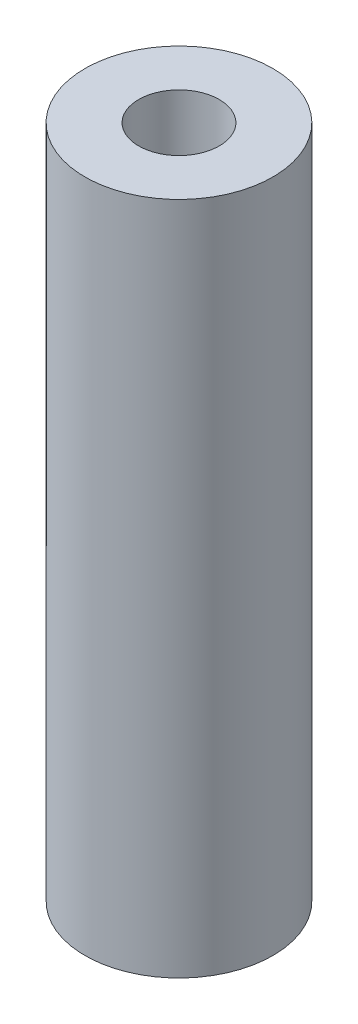
ISO-10303-21;
HEADER;
FILE_DESCRIPTION(('STEP AP214'),'2;1');
FILE_NAME('part.step','',(''),(''),'','','');
FILE_SCHEMA(('AUTOMOTIVE_DESIGN { 1 0 10303 214 1 1 1 1 }'));
ENDSEC;
DATA;
#1=APPLICATION_CONTEXT('core data for automotive mechanical design processes');
#2=APPLICATION_PROTOCOL_DEFINITION('international standard','automotive_design',2000,#1);
#3=PRODUCT_CONTEXT('',#1,'mechanical');
#4=PRODUCT('Part','Part','',(#3));
#5=PRODUCT_RELATED_PRODUCT_CATEGORY('part','',(#4));
#6=PRODUCT_DEFINITION_FORMATION('','',#4);
#7=PRODUCT_DEFINITION_CONTEXT('part definition',#1,'design');
#8=PRODUCT_DEFINITION('design','',#6,#7);
#9=PRODUCT_DEFINITION_SHAPE('','',#8);
#10=(LENGTH_UNIT() NAMED_UNIT(*) SI_UNIT(.MILLI.,.METRE.));
#11=(NAMED_UNIT(*) PLANE_ANGLE_UNIT() SI_UNIT($,.RADIAN.));
#12=(NAMED_UNIT(*) SI_UNIT($,.STERADIAN.) SOLID_ANGLE_UNIT());
#13=UNCERTAINTY_MEASURE_WITH_UNIT(LENGTH_MEASURE(1.E-05),#10,'distance_accuracy_value','');
#14=(GEOMETRIC_REPRESENTATION_CONTEXT(3) GLOBAL_UNCERTAINTY_ASSIGNED_CONTEXT((#13)) GLOBAL_UNIT_ASSIGNED_CONTEXT((#10,
#11,#12)) REPRESENTATION_CONTEXT('',''));
#15=CARTESIAN_POINT('',(0.,0.,0.));
#16=DIRECTION('',(0.,0.,1.));
#17=DIRECTION('',(1.,0.,0.));
#18=AXIS2_PLACEMENT_3D('',#15,#16,#17);
#19=CARTESIAN_POINT('',(0.,28.699968,0.));
#20=DIRECTION('',(0.,1.,0.));
#21=DIRECTION('',(0.,0.,1.));
#22=AXIS2_PLACEMENT_3D('',#19,#20,#21);
#23=PLANE('',#22);
#24=CARTESIAN_POINT('',(0.,28.699968,0.));
#25=DIRECTION('',(0.,1.,0.));
#26=DIRECTION('',(0.,0.,1.));
#27=AXIS2_PLACEMENT_3D('',#24,#25,#26);
#28=CIRCLE('',#27,4.);
#29=CARTESIAN_POINT('',(0.,28.699968,-4.));
#30=VERTEX_POINT('',#29);
#31=EDGE_CURVE('E10',#30,#30,#28,.T.);
#32=ORIENTED_EDGE('',*,*,#31,.T.);
#33=EDGE_LOOP('',(#32));
#34=FACE_BOUND('',#33,.T.);
#35=CARTESIAN_POINT('',(0.,28.699968,0.));
#36=DIRECTION('',(0.,1.,0.));
#37=DIRECTION('',(0.,0.,1.));
#38=AXIS2_PLACEMENT_3D('',#35,#36,#37);
#39=CIRCLE('',#38,1.7145);
#40=CARTESIAN_POINT('',(0.,28.699968,-1.7145));
#41=VERTEX_POINT('',#40);
#42=EDGE_CURVE('E52',#41,#41,#39,.T.);
#43=ORIENTED_EDGE('',*,*,#42,.F.);
#44=EDGE_LOOP('',(#43));
#45=FACE_BOUND('',#44,.T.);
#46=ADVANCED_FACE('F41',(#34,#45),#23,.T.);
#47=CARTESIAN_POINT('',(0.,0.,0.));
#48=DIRECTION('',(0.,1.,0.));
#49=DIRECTION('',(0.,0.,1.));
#50=AXIS2_PLACEMENT_3D('',#47,#48,#49);
#51=PLANE('',#50);
#52=CARTESIAN_POINT('',(0.,0.,0.));
#53=DIRECTION('',(0.,1.,0.));
#54=DIRECTION('',(0.,0.,1.));
#55=AXIS2_PLACEMENT_3D('',#52,#53,#54);
#56=CIRCLE('',#55,4.);
#57=CARTESIAN_POINT('',(0.,0.,-4.));
#58=VERTEX_POINT('',#57);
#59=EDGE_CURVE('E45',#58,#58,#56,.T.);
#60=ORIENTED_EDGE('',*,*,#59,.F.);
#61=EDGE_LOOP('',(#60));
#62=FACE_BOUND('',#61,.T.);
#63=CARTESIAN_POINT('',(0.,0.,0.));
#64=DIRECTION('',(0.,1.,0.));
#65=DIRECTION('',(0.,0.,1.));
#66=AXIS2_PLACEMENT_3D('',#63,#64,#65);
#67=CIRCLE('',#66,1.7145);
#68=CARTESIAN_POINT('',(0.,0.,-1.7145));
#69=VERTEX_POINT('',#68);
#70=EDGE_CURVE('E54',#69,#69,#67,.T.);
#71=ORIENTED_EDGE('',*,*,#70,.T.);
#72=EDGE_LOOP('',(#71));
#73=FACE_BOUND('',#72,.T.);
#74=ADVANCED_FACE('F64',(#62,#73),#51,.F.);
#75=CARTESIAN_POINT('',(0.,28.699968,0.));
#76=DIRECTION('',(0.,-1.,0.));
#77=DIRECTION('',(0.,0.,-1.));
#78=AXIS2_PLACEMENT_3D('',#75,#76,#77);
#79=CYLINDRICAL_SURFACE('',#78,4.);
#80=CARTESIAN_POINT('',(0.,28.699968,-4.));
#81=CARTESIAN_POINT('',(0.,28.40101,-4.));
#82=CARTESIAN_POINT('',(0.,28.102052,-4.));
#83=CARTESIAN_POINT('',(0.,27.504136,-4.));
#84=CARTESIAN_POINT('',(0.,27.205178,-4.));
#85=CARTESIAN_POINT('',(0.,26.607262,-4.));
#86=CARTESIAN_POINT('',(0.,26.308304,-4.));
#87=CARTESIAN_POINT('',(0.,25.710388,-4.));
#88=CARTESIAN_POINT('',(0.,25.41143,-4.));
#89=CARTESIAN_POINT('',(0.,24.813514,-4.));
#90=CARTESIAN_POINT('',(0.,24.514556,-4.));
#91=CARTESIAN_POINT('',(0.,23.91664,-4.));
#92=CARTESIAN_POINT('',(0.,23.617682,-4.));
#93=CARTESIAN_POINT('',(0.,23.019766,-4.));
#94=CARTESIAN_POINT('',(0.,22.720808,-4.));
#95=CARTESIAN_POINT('',(0.,22.122892,-4.));
#96=CARTESIAN_POINT('',(0.,21.823934,-4.));
#97=CARTESIAN_POINT('',(0.,21.226018,-4.));
#98=CARTESIAN_POINT('',(0.,20.92706,-4.));
#99=CARTESIAN_POINT('',(0.,20.329144,-4.));
#100=CARTESIAN_POINT('',(0.,20.030186,-4.));
#101=CARTESIAN_POINT('',(0.,19.43227,-4.));
#102=CARTESIAN_POINT('',(0.,19.133312,-4.));
#103=CARTESIAN_POINT('',(0.,18.535396,-4.));
#104=CARTESIAN_POINT('',(0.,18.236438,-4.));
#105=CARTESIAN_POINT('',(0.,17.638522,-4.));
#106=CARTESIAN_POINT('',(0.,17.339564,-4.));
#107=CARTESIAN_POINT('',(0.,16.741648,-4.));
#108=CARTESIAN_POINT('',(0.,16.44269,-4.));
#109=CARTESIAN_POINT('',(0.,15.844774,-4.));
#110=CARTESIAN_POINT('',(0.,15.545816,-4.));
#111=CARTESIAN_POINT('',(0.,14.9479,-4.));
#112=CARTESIAN_POINT('',(0.,14.648942,-4.));
#113=CARTESIAN_POINT('',(0.,14.051026,-4.));
#114=CARTESIAN_POINT('',(0.,13.752068,-4.));
#115=CARTESIAN_POINT('',(0.,13.154152,-4.));
#116=CARTESIAN_POINT('',(0.,12.855194,-4.));
#117=CARTESIAN_POINT('',(0.,12.257278,-4.));
#118=CARTESIAN_POINT('',(0.,11.95832,-4.));
#119=CARTESIAN_POINT('',(0.,11.360404,-4.));
#120=CARTESIAN_POINT('',(0.,11.061446,-4.));
#121=CARTESIAN_POINT('',(0.,10.46353,-4.));
#122=CARTESIAN_POINT('',(0.,10.164572,-4.));
#123=CARTESIAN_POINT('',(0.,9.566656,-4.));
#124=CARTESIAN_POINT('',(0.,9.267698,-4.));
#125=CARTESIAN_POINT('',(0.,8.669782,-4.));
#126=CARTESIAN_POINT('',(0.,8.370824,-4.));
#127=CARTESIAN_POINT('',(0.,7.772908,-4.));
#128=CARTESIAN_POINT('',(0.,7.47395,-4.));
#129=CARTESIAN_POINT('',(0.,6.876034,-4.));
#130=CARTESIAN_POINT('',(0.,6.577076,-4.));
#131=CARTESIAN_POINT('',(0.,5.97916,-4.));
#132=CARTESIAN_POINT('',(0.,5.680202,-4.));
#133=CARTESIAN_POINT('',(0.,5.082286,-4.));
#134=CARTESIAN_POINT('',(0.,4.783328,-4.));
#135=CARTESIAN_POINT('',(0.,4.185412,-4.));
#136=CARTESIAN_POINT('',(0.,3.886454,-4.));
#137=CARTESIAN_POINT('',(0.,3.288538,-4.));
#138=CARTESIAN_POINT('',(0.,2.98958,-4.));
#139=CARTESIAN_POINT('',(0.,2.391664,-4.));
#140=CARTESIAN_POINT('',(0.,2.092706,-4.));
#141=CARTESIAN_POINT('',(0.,1.49479,-4.));
#142=CARTESIAN_POINT('',(0.,1.195832,-4.));
#143=CARTESIAN_POINT('',(0.,0.597915999999996,-4.));
#144=CARTESIAN_POINT('',(0.,0.298957999999996,-4.));
#145=CARTESIAN_POINT('',(0.,0.,-4.));
#146=B_SPLINE_CURVE_WITH_KNOTS('',3,(#80,#81,#82,#83,#84,#85,#86,#87,#88,#89,#90,#91,#92,#93,
#94,#95,#96,#97,#98,#99,#100,#101,#102,#103,#104,#105,#106,#107,#108,#109,#110,#111,#112,#113,
#114,#115,#116,#117,#118,#119,#120,#121,#122,#123,#124,#125,#126,#127,#128,#129,#130,#131,#132,
#133,#134,#135,#136,#137,#138,#139,#140,#141,#142,#143,#144,#145),.UNSPECIFIED.,.F.,.F.,(4,2,2,
2,2,2,2,2,2,2,2,2,2,2,2,2,2,2,2,2,2,2,2,2,2,2,2,2,2,2,2,2,4),(0.,0.896873999999999,1.793748,
2.690622,3.587496,4.48437,5.381244,6.278118,7.174992,8.071866,8.96874,9.865614,10.762488,
11.659362,12.556236,13.45311,14.349984,15.246858,16.143732,17.040606,17.93748,18.834354,
19.731228,20.628102,21.524976,22.42185,23.318724,24.215598,25.112472,26.009346,26.90622,
27.803094,28.699968),.UNSPECIFIED.);
#147=EDGE_CURVE('BSEAM43',#30,#58,#146,.T.);
#148=ORIENTED_EDGE('',*,*,#31,.F.);
#149=ORIENTED_EDGE('',*,*,#59,.T.);
#150=ORIENTED_EDGE('',*,*,#147,.T.);
#151=ORIENTED_EDGE('',*,*,#147,.F.);
#152=EDGE_LOOP('',(#148,#150,#149,#151));
#153=FACE_BOUND('',#152,.T.);
#154=ADVANCED_FACE('F43',(#153),#79,.T.);
#155=CARTESIAN_POINT('',(0.,28.699968,0.));
#156=DIRECTION('',(0.,-1.,0.));
#157=DIRECTION('',(0.,0.,-1.));
#158=AXIS2_PLACEMENT_3D('',#155,#156,#157);
#159=CYLINDRICAL_SURFACE('',#158,1.7145);
#160=CARTESIAN_POINT('',(0.,28.699968,-1.7145));
#161=CARTESIAN_POINT('',(0.,28.40101,-1.7145));
#162=CARTESIAN_POINT('',(0.,28.102052,-1.7145));
#163=CARTESIAN_POINT('',(0.,27.504136,-1.7145));
#164=CARTESIAN_POINT('',(0.,27.205178,-1.7145));
#165=CARTESIAN_POINT('',(0.,26.607262,-1.7145));
#166=CARTESIAN_POINT('',(0.,26.308304,-1.7145));
#167=CARTESIAN_POINT('',(0.,25.710388,-1.7145));
#168=CARTESIAN_POINT('',(0.,25.41143,-1.7145));
#169=CARTESIAN_POINT('',(0.,24.813514,-1.7145));
#170=CARTESIAN_POINT('',(0.,24.514556,-1.7145));
#171=CARTESIAN_POINT('',(0.,23.91664,-1.7145));
#172=CARTESIAN_POINT('',(0.,23.617682,-1.7145));
#173=CARTESIAN_POINT('',(0.,23.019766,-1.7145));
#174=CARTESIAN_POINT('',(0.,22.720808,-1.7145));
#175=CARTESIAN_POINT('',(0.,22.122892,-1.7145));
#176=CARTESIAN_POINT('',(0.,21.823934,-1.7145));
#177=CARTESIAN_POINT('',(0.,21.226018,-1.7145));
#178=CARTESIAN_POINT('',(0.,20.92706,-1.7145));
#179=CARTESIAN_POINT('',(0.,20.329144,-1.7145));
#180=CARTESIAN_POINT('',(0.,20.030186,-1.7145));
#181=CARTESIAN_POINT('',(0.,19.43227,-1.7145));
#182=CARTESIAN_POINT('',(0.,19.133312,-1.7145));
#183=CARTESIAN_POINT('',(0.,18.535396,-1.7145));
#184=CARTESIAN_POINT('',(0.,18.236438,-1.7145));
#185=CARTESIAN_POINT('',(0.,17.638522,-1.7145));
#186=CARTESIAN_POINT('',(0.,17.339564,-1.7145));
#187=CARTESIAN_POINT('',(0.,16.741648,-1.7145));
#188=CARTESIAN_POINT('',(0.,16.44269,-1.7145));
#189=CARTESIAN_POINT('',(0.,15.844774,-1.7145));
#190=CARTESIAN_POINT('',(0.,15.545816,-1.7145));
#191=CARTESIAN_POINT('',(0.,14.9479,-1.7145));
#192=CARTESIAN_POINT('',(0.,14.648942,-1.7145));
#193=CARTESIAN_POINT('',(0.,14.051026,-1.7145));
#194=CARTESIAN_POINT('',(0.,13.752068,-1.7145));
#195=CARTESIAN_POINT('',(0.,13.154152,-1.7145));
#196=CARTESIAN_POINT('',(0.,12.855194,-1.7145));
#197=CARTESIAN_POINT('',(0.,12.257278,-1.7145));
#198=CARTESIAN_POINT('',(0.,11.95832,-1.7145));
#199=CARTESIAN_POINT('',(0.,11.360404,-1.7145));
#200=CARTESIAN_POINT('',(0.,11.061446,-1.7145));
#201=CARTESIAN_POINT('',(0.,10.46353,-1.7145));
#202=CARTESIAN_POINT('',(0.,10.164572,-1.7145));
#203=CARTESIAN_POINT('',(0.,9.566656,-1.7145));
#204=CARTESIAN_POINT('',(0.,9.267698,-1.7145));
#205=CARTESIAN_POINT('',(0.,8.669782,-1.7145));
#206=CARTESIAN_POINT('',(0.,8.370824,-1.7145));
#207=CARTESIAN_POINT('',(0.,7.772908,-1.7145));
#208=CARTESIAN_POINT('',(0.,7.47395,-1.7145));
#209=CARTESIAN_POINT('',(0.,6.876034,-1.7145));
#210=CARTESIAN_POINT('',(0.,6.577076,-1.7145));
#211=CARTESIAN_POINT('',(0.,5.97916,-1.7145));
#212=CARTESIAN_POINT('',(0.,5.680202,-1.7145));
#213=CARTESIAN_POINT('',(0.,5.082286,-1.7145));
#214=CARTESIAN_POINT('',(0.,4.783328,-1.7145));
#215=CARTESIAN_POINT('',(0.,4.185412,-1.7145));
#216=CARTESIAN_POINT('',(0.,3.886454,-1.7145));
#217=CARTESIAN_POINT('',(0.,3.288538,-1.7145));
#218=CARTESIAN_POINT('',(0.,2.98958,-1.7145));
#219=CARTESIAN_POINT('',(0.,2.391664,-1.7145));
#220=CARTESIAN_POINT('',(0.,2.092706,-1.7145));
#221=CARTESIAN_POINT('',(0.,1.49479,-1.7145));
#222=CARTESIAN_POINT('',(0.,1.195832,-1.7145));
#223=CARTESIAN_POINT('',(0.,0.597915999999996,-1.7145));
#224=CARTESIAN_POINT('',(0.,0.298957999999996,-1.7145));
#225=CARTESIAN_POINT('',(0.,0.,-1.7145));
#226=B_SPLINE_CURVE_WITH_KNOTS('',3,(#160,#161,#162,#163,#164,#165,#166,#167,#168,#169,#170,
#171,#172,#173,#174,#175,#176,#177,#178,#179,#180,#181,#182,#183,#184,#185,#186,#187,#188,#189,
#190,#191,#192,#193,#194,#195,#196,#197,#198,#199,#200,#201,#202,#203,#204,#205,#206,#207,#208,
#209,#210,#211,#212,#213,#214,#215,#216,#217,#218,#219,#220,#221,#222,#223,#224,#225),
.UNSPECIFIED.,.F.,.F.,(4,2,2,2,2,2,2,2,2,2,2,2,2,2,2,2,2,2,2,2,2,2,2,2,2,2,2,2,2,2,2,2,4),(0.,
0.896873999999999,1.793748,2.690622,3.587496,4.48437,5.381244,6.278118,7.174992,8.071866,
8.96874,9.865614,10.762488,11.659362,12.556236,13.45311,14.349984,15.246858,16.143732,17.040606,
17.93748,18.834354,19.731228,20.628102,21.524976,22.42185,23.318724,24.215598,25.112472,
26.009346,26.90622,27.803094,28.699968),.UNSPECIFIED.);
#227=EDGE_CURVE('BSEAM60',#41,#69,#226,.T.);
#228=ORIENTED_EDGE('',*,*,#42,.T.);
#229=ORIENTED_EDGE('',*,*,#70,.F.);
#230=ORIENTED_EDGE('',*,*,#227,.T.);
#231=ORIENTED_EDGE('',*,*,#227,.F.);
#232=EDGE_LOOP('',(#228,#230,#229,#231));
#233=FACE_BOUND('',#232,.T.);
#234=ADVANCED_FACE('F60',(#233),#159,.F.);
#235=CLOSED_SHELL('',(#46,#74,#154,#234));
#236=MANIFOLD_SOLID_BREP('B2',#235);
#237=ADVANCED_BREP_SHAPE_REPRESENTATION('',(#18,#236),#14);
#238=SHAPE_DEFINITION_REPRESENTATION(#9,#237);
ENDSEC;
END-ISO-10303-21;
